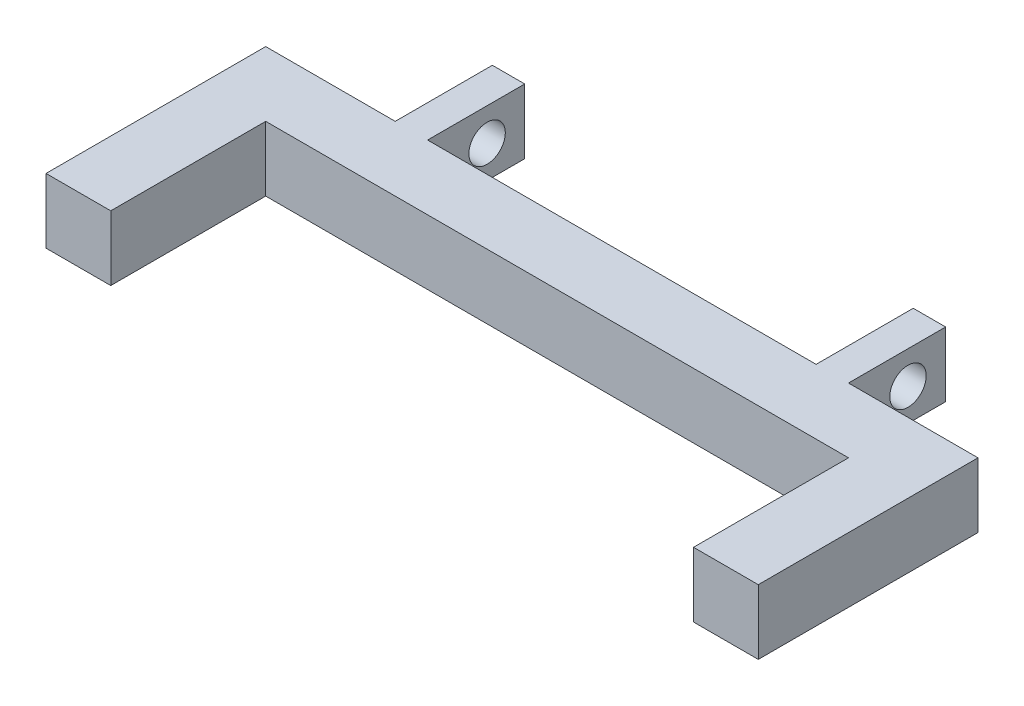
ISO-10303-21;
HEADER;
FILE_DESCRIPTION(('STEP AP214'),'2;1');
FILE_NAME('part.step','',(''),(''),'','','');
FILE_SCHEMA(('AUTOMOTIVE_DESIGN { 1 0 10303 214 1 1 1 1 }'));
ENDSEC;
DATA;
#1=APPLICATION_CONTEXT('core data for automotive mechanical design processes');
#2=APPLICATION_PROTOCOL_DEFINITION('international standard','automotive_design',2000,#1);
#3=PRODUCT_CONTEXT('',#1,'mechanical');
#4=PRODUCT('Part','Part','',(#3));
#5=PRODUCT_RELATED_PRODUCT_CATEGORY('part','',(#4));
#6=PRODUCT_DEFINITION_FORMATION('','',#4);
#7=PRODUCT_DEFINITION_CONTEXT('part definition',#1,'design');
#8=PRODUCT_DEFINITION('design','',#6,#7);
#9=PRODUCT_DEFINITION_SHAPE('','',#8);
#10=(LENGTH_UNIT() NAMED_UNIT(*) SI_UNIT(.MILLI.,.METRE.));
#11=(NAMED_UNIT(*) PLANE_ANGLE_UNIT() SI_UNIT($,.RADIAN.));
#12=(NAMED_UNIT(*) SI_UNIT($,.STERADIAN.) SOLID_ANGLE_UNIT());
#13=UNCERTAINTY_MEASURE_WITH_UNIT(LENGTH_MEASURE(1.E-05),#10,'distance_accuracy_value','');
#14=(GEOMETRIC_REPRESENTATION_CONTEXT(3) GLOBAL_UNCERTAINTY_ASSIGNED_CONTEXT((#13)) GLOBAL_UNIT_ASSIGNED_CONTEXT((#10,
#11,#12)) REPRESENTATION_CONTEXT('',''));
#15=CARTESIAN_POINT('',(0.,0.,0.));
#16=DIRECTION('',(0.,0.,1.));
#17=DIRECTION('',(1.,0.,0.));
#18=AXIS2_PLACEMENT_3D('',#15,#16,#17);
#19=CARTESIAN_POINT('',(228.6,50.8,0.));
#20=DIRECTION('',(-1.,0.,0.));
#21=DIRECTION('',(0.,0.,1.));
#22=AXIS2_PLACEMENT_3D('',#19,#20,#21);
#23=PLANE('',#22);
#24=DIRECTION('',(0.,0.,-1.));
#25=VECTOR('',#24,1.);
#26=CARTESIAN_POINT('',(228.6,0.,0.));
#27=LINE('',#26,#25);
#28=CARTESIAN_POINT('',(228.6,0.,86.1846503260621));
#29=VERTEX_POINT('',#28);
#30=CARTESIAN_POINT('',(228.6,0.,-35.3846503260623));
#31=VERTEX_POINT('',#30);
#32=EDGE_CURVE('E190',#29,#31,#27,.T.);
#33=ORIENTED_EDGE('',*,*,#32,.F.);
#34=DIRECTION('',(0.,-1.,0.));
#35=VECTOR('',#34,1.);
#36=CARTESIAN_POINT('',(228.6,50.8,86.1846503260621));
#37=LINE('',#36,#35);
#38=CARTESIAN_POINT('',(228.6,50.8,86.1846503260621));
#39=VERTEX_POINT('',#38);
#40=EDGE_CURVE('E11',#39,#29,#37,.T.);
#41=ORIENTED_EDGE('',*,*,#40,.F.);
#42=DIRECTION('',(0.,0.,-1.));
#43=VECTOR('',#42,1.);
#44=CARTESIAN_POINT('',(228.6,50.8,0.));
#45=LINE('',#44,#43);
#46=CARTESIAN_POINT('',(228.6,50.8,-35.3846503260623));
#47=VERTEX_POINT('',#46);
#48=EDGE_CURVE('E241',#39,#47,#45,.T.);
#49=ORIENTED_EDGE('',*,*,#48,.T.);
#50=DIRECTION('',(0.,-1.,0.));
#51=VECTOR('',#50,1.);
#52=CARTESIAN_POINT('',(228.6,50.8,-35.3846503260623));
#53=LINE('',#52,#51);
#54=EDGE_CURVE('E118',#47,#31,#53,.T.);
#55=ORIENTED_EDGE('',*,*,#54,.T.);
#56=EDGE_LOOP('',(#33,#41,#49,#55));
#57=FACE_BOUND('',#56,.T.);
#58=ADVANCED_FACE('F41',(#57),#23,.T.);
#59=CARTESIAN_POINT('',(0.,50.8,86.1846503260622));
#60=DIRECTION('',(0.,0.,-1.));
#61=DIRECTION('',(-1.,0.,0.));
#62=AXIS2_PLACEMENT_3D('',#59,#60,#61);
#63=PLANE('',#62);
#64=DIRECTION('',(1.,0.,0.));
#65=VECTOR('',#64,1.);
#66=CARTESIAN_POINT('',(0.,0.,86.1846503260622));
#67=LINE('',#66,#65);
#68=CARTESIAN_POINT('',(279.4,0.,86.1846503260621));
#69=VERTEX_POINT('',#68);
#70=EDGE_CURVE('E194',#29,#69,#67,.T.);
#71=ORIENTED_EDGE('',*,*,#70,.T.);
#72=DIRECTION('',(0.,-1.,0.));
#73=VECTOR('',#72,1.);
#74=CARTESIAN_POINT('',(279.4,50.8,86.1846503260621));
#75=LINE('',#74,#73);
#76=CARTESIAN_POINT('',(279.4,50.8,86.1846503260621));
#77=VERTEX_POINT('',#76);
#78=EDGE_CURVE('E51',#77,#69,#75,.T.);
#79=ORIENTED_EDGE('',*,*,#78,.F.);
#80=DIRECTION('',(1.,0.,0.));
#81=VECTOR('',#80,1.);
#82=CARTESIAN_POINT('',(0.,50.8,86.1846503260622));
#83=LINE('',#82,#81);
#84=EDGE_CURVE('E173',#39,#77,#83,.T.);
#85=ORIENTED_EDGE('',*,*,#84,.F.);
#86=ORIENTED_EDGE('',*,*,#40,.T.);
#87=EDGE_LOOP('',(#71,#79,#85,#86));
#88=FACE_BOUND('',#87,.T.);
#89=ADVANCED_FACE('F371',(#88),#63,.F.);
#90=CARTESIAN_POINT('',(279.4,50.8,-1.79960301461283E-13));
#91=DIRECTION('',(-1.,0.,0.));
#92=DIRECTION('',(0.,0.,1.));
#93=AXIS2_PLACEMENT_3D('',#90,#91,#92);
#94=PLANE('',#93);
#95=DIRECTION('',(0.,0.,-1.));
#96=VECTOR('',#95,1.);
#97=CARTESIAN_POINT('',(279.4,0.,-1.79960301461283E-13));
#98=LINE('',#97,#96);
#99=CARTESIAN_POINT('',(279.4,0.,-86.1846503260623));
#100=VERTEX_POINT('',#99);
#101=EDGE_CURVE('E198',#69,#100,#98,.T.);
#102=ORIENTED_EDGE('',*,*,#101,.T.);
#103=DIRECTION('',(0.,-1.,0.));
#104=VECTOR('',#103,1.);
#105=CARTESIAN_POINT('',(279.4,50.8,-86.1846503260623));
#106=LINE('',#105,#104);
#107=CARTESIAN_POINT('',(279.4,50.8,-86.1846503260623));
#108=VERTEX_POINT('',#107);
#109=EDGE_CURVE('E275',#108,#100,#106,.T.);
#110=ORIENTED_EDGE('',*,*,#109,.F.);
#111=DIRECTION('',(0.,0.,-1.));
#112=VECTOR('',#111,1.);
#113=CARTESIAN_POINT('',(279.4,50.8,-1.79960301461283E-13));
#114=LINE('',#113,#112);
#115=EDGE_CURVE('E286',#77,#108,#114,.T.);
#116=ORIENTED_EDGE('',*,*,#115,.F.);
#117=ORIENTED_EDGE('',*,*,#78,.T.);
#118=EDGE_LOOP('',(#102,#110,#116,#117));
#119=FACE_BOUND('',#118,.T.);
#120=ADVANCED_FACE('F284',(#119),#94,.F.);
#121=CARTESIAN_POINT('',(0.,50.8,-86.1846503260623));
#122=DIRECTION('',(0.,0.,-1.));
#123=DIRECTION('',(-1.,0.,0.));
#124=AXIS2_PLACEMENT_3D('',#121,#122,#123);
#125=PLANE('',#124);
#126=DIRECTION('',(1.,0.,0.));
#127=VECTOR('',#126,1.);
#128=CARTESIAN_POINT('',(0.,0.,-86.1846503260623));
#129=LINE('',#128,#127);
#130=CARTESIAN_POINT('',(177.8,0.,-86.1846503260623));
#131=VERTEX_POINT('',#130);
#132=EDGE_CURVE('E202',#131,#100,#129,.T.);
#133=ORIENTED_EDGE('',*,*,#132,.F.);
#134=DIRECTION('',(0.,-1.,0.));
#135=VECTOR('',#134,1.);
#136=CARTESIAN_POINT('',(177.8,50.8,-86.1846503260623));
#137=LINE('',#136,#135);
#138=CARTESIAN_POINT('',(177.8,50.8,-86.1846503260623));
#139=VERTEX_POINT('',#138);
#140=EDGE_CURVE('E272',#139,#131,#137,.T.);
#141=ORIENTED_EDGE('',*,*,#140,.F.);
#142=DIRECTION('',(1.,0.,0.));
#143=VECTOR('',#142,1.);
#144=CARTESIAN_POINT('',(0.,50.8,-86.1846503260623));
#145=LINE('',#144,#143);
#146=EDGE_CURVE('E298',#139,#108,#145,.T.);
#147=ORIENTED_EDGE('',*,*,#146,.T.);
#148=ORIENTED_EDGE('',*,*,#109,.T.);
#149=EDGE_LOOP('',(#133,#141,#147,#148));
#150=FACE_BOUND('',#149,.T.);
#151=ADVANCED_FACE('F294',(#150),#125,.T.);
#152=CARTESIAN_POINT('',(177.8,50.8,0.));
#153=DIRECTION('',(-1.,0.,0.));
#154=DIRECTION('',(0.,0.,1.));
#155=AXIS2_PLACEMENT_3D('',#152,#153,#154);
#156=PLANE('',#155);
#157=CARTESIAN_POINT('',(177.8,25.273316146111,-132.859522709877));
#158=DIRECTION('',(1.,0.,0.));
#159=DIRECTION('',(0.,0.,-1.));
#160=AXIS2_PLACEMENT_3D('',#157,#158,#159);
#161=CIRCLE('',#160,14.2875);
#162=CARTESIAN_POINT('',(177.8,25.273316146111,-147.147022709877));
#163=VERTEX_POINT('',#162);
#164=EDGE_CURVE('E363',#163,#163,#161,.T.);
#165=ORIENTED_EDGE('',*,*,#164,.F.);
#166=EDGE_LOOP('',(#165));
#167=FACE_BOUND('',#166,.T.);
#168=DIRECTION('',(0.,0.,-1.));
#169=VECTOR('',#168,1.);
#170=CARTESIAN_POINT('',(177.8,0.,0.));
#171=LINE('',#170,#169);
#172=CARTESIAN_POINT('',(177.8,0.,-162.384650326062));
#173=VERTEX_POINT('',#172);
#174=EDGE_CURVE('E206',#131,#173,#171,.T.);
#175=ORIENTED_EDGE('',*,*,#174,.T.);
#176=DIRECTION('',(0.,-1.,0.));
#177=VECTOR('',#176,1.);
#178=CARTESIAN_POINT('',(177.8,50.8,-162.384650326062));
#179=LINE('',#178,#177);
#180=CARTESIAN_POINT('',(177.8,50.8,-162.384650326062));
#181=VERTEX_POINT('',#180);
#182=EDGE_CURVE('E269',#181,#173,#179,.T.);
#183=ORIENTED_EDGE('',*,*,#182,.F.);
#184=DIRECTION('',(0.,0.,-1.));
#185=VECTOR('',#184,1.);
#186=CARTESIAN_POINT('',(177.8,50.8,0.));
#187=LINE('',#186,#185);
#188=EDGE_CURVE('E300',#139,#181,#187,.T.);
#189=ORIENTED_EDGE('',*,*,#188,.F.);
#190=ORIENTED_EDGE('',*,*,#140,.T.);
#191=EDGE_LOOP('',(#175,#183,#189,#190));
#192=FACE_BOUND('',#191,.T.);
#193=ADVANCED_FACE('F410',(#167,#192),#156,.F.);
#194=CARTESIAN_POINT('',(0.,50.8,-162.384650326062));
#195=DIRECTION('',(0.,0.,-1.));
#196=DIRECTION('',(-1.,0.,0.));
#197=AXIS2_PLACEMENT_3D('',#194,#195,#196);
#198=PLANE('',#197);
#199=DIRECTION('',(1.,0.,0.));
#200=VECTOR('',#199,1.);
#201=CARTESIAN_POINT('',(0.,0.,-162.384650326062));
#202=LINE('',#201,#200);
#203=CARTESIAN_POINT('',(152.4,0.,-162.384650326062));
#204=VERTEX_POINT('',#203);
#205=EDGE_CURVE('E212',#204,#173,#202,.T.);
#206=ORIENTED_EDGE('',*,*,#205,.F.);
#207=DIRECTION('',(0.,-1.,0.));
#208=VECTOR('',#207,1.);
#209=CARTESIAN_POINT('',(152.4,50.8,-162.384650326062));
#210=LINE('',#209,#208);
#211=CARTESIAN_POINT('',(152.4,50.8,-162.384650326062));
#212=VERTEX_POINT('',#211);
#213=EDGE_CURVE('E266',#212,#204,#210,.T.);
#214=ORIENTED_EDGE('',*,*,#213,.F.);
#215=DIRECTION('',(1.,0.,0.));
#216=VECTOR('',#215,1.);
#217=CARTESIAN_POINT('',(0.,50.8,-162.384650326062));
#218=LINE('',#217,#216);
#219=EDGE_CURVE('E306',#212,#181,#218,.T.);
#220=ORIENTED_EDGE('',*,*,#219,.T.);
#221=ORIENTED_EDGE('',*,*,#182,.T.);
#222=EDGE_LOOP('',(#206,#214,#220,#221));
#223=FACE_BOUND('',#222,.T.);
#224=ADVANCED_FACE('F406',(#223),#198,.T.);
#225=CARTESIAN_POINT('',(152.4,50.8,0.));
#226=DIRECTION('',(-1.,0.,0.));
#227=DIRECTION('',(0.,0.,1.));
#228=AXIS2_PLACEMENT_3D('',#225,#226,#227);
#229=PLANE('',#228);
#230=CARTESIAN_POINT('',(152.4,25.273316146111,-132.859522709877));
#231=DIRECTION('',(-1.,0.,0.));
#232=DIRECTION('',(0.,0.,1.));
#233=AXIS2_PLACEMENT_3D('',#230,#231,#232);
#234=CIRCLE('',#233,14.2875);
#235=CARTESIAN_POINT('',(152.4,25.273316146111,-118.572022709877));
#236=VERTEX_POINT('',#235);
#237=EDGE_CURVE('E195',#236,#236,#234,.T.);
#238=ORIENTED_EDGE('',*,*,#237,.F.);
#239=EDGE_LOOP('',(#238));
#240=FACE_BOUND('',#239,.T.);
#241=DIRECTION('',(0.,0.,-1.));
#242=VECTOR('',#241,1.);
#243=CARTESIAN_POINT('',(152.4,0.,0.));
#244=LINE('',#243,#242);
#245=CARTESIAN_POINT('',(152.4,0.,-86.1846503260623));
#246=VERTEX_POINT('',#245);
#247=EDGE_CURVE('E216',#246,#204,#244,.T.);
#248=ORIENTED_EDGE('',*,*,#247,.F.);
#249=DIRECTION('',(0.,-1.,0.));
#250=VECTOR('',#249,1.);
#251=CARTESIAN_POINT('',(152.4,50.8,-86.1846503260623));
#252=LINE('',#251,#250);
#253=CARTESIAN_POINT('',(152.4,50.8,-86.1846503260623));
#254=VERTEX_POINT('',#253);
#255=EDGE_CURVE('E263',#254,#246,#252,.T.);
#256=ORIENTED_EDGE('',*,*,#255,.F.);
#257=DIRECTION('',(0.,0.,-1.));
#258=VECTOR('',#257,1.);
#259=CARTESIAN_POINT('',(152.4,50.8,0.));
#260=LINE('',#259,#258);
#261=EDGE_CURVE('E315',#254,#212,#260,.T.);
#262=ORIENTED_EDGE('',*,*,#261,.T.);
#263=ORIENTED_EDGE('',*,*,#213,.T.);
#264=EDGE_LOOP('',(#248,#256,#262,#263));
#265=FACE_BOUND('',#264,.T.);
#266=ADVANCED_FACE('F403',(#240,#265),#229,.T.);
#267=CARTESIAN_POINT('',(-152.4,0.,-86.1846503260623));
#268=VERTEX_POINT('',#267);
#269=EDGE_CURVE('E208',#268,#246,#129,.T.);
#270=ORIENTED_EDGE('',*,*,#269,.F.);
#271=DIRECTION('',(0.,-1.,0.));
#272=VECTOR('',#271,1.);
#273=CARTESIAN_POINT('',(-152.4,50.8,-86.1846503260623));
#274=LINE('',#273,#272);
#275=CARTESIAN_POINT('',(-152.4,50.8,-86.1846503260623));
#276=VERTEX_POINT('',#275);
#277=EDGE_CURVE('E260',#276,#268,#274,.T.);
#278=ORIENTED_EDGE('',*,*,#277,.F.);
#279=EDGE_CURVE('E303',#276,#254,#145,.T.);
#280=ORIENTED_EDGE('',*,*,#279,.T.);
#281=ORIENTED_EDGE('',*,*,#255,.T.);
#282=EDGE_LOOP('',(#270,#278,#280,#281));
#283=FACE_BOUND('',#282,.T.);
#284=ADVANCED_FACE('F390',(#283),#125,.T.);
#285=CARTESIAN_POINT('',(-152.4,50.8,0.));
#286=DIRECTION('',(-1.,0.,0.));
#287=DIRECTION('',(0.,0.,1.));
#288=AXIS2_PLACEMENT_3D('',#285,#286,#287);
#289=PLANE('',#288);
#290=CARTESIAN_POINT('',(-152.4,25.273316146111,-132.859522709877));
#291=DIRECTION('',(-1.,0.,0.));
#292=DIRECTION('',(0.,0.,1.));
#293=AXIS2_PLACEMENT_3D('',#290,#291,#292);
#294=CIRCLE('',#293,14.2875);
#295=CARTESIAN_POINT('',(-152.4,25.273316146111,-118.572022709877));
#296=VERTEX_POINT('',#295);
#297=EDGE_CURVE('E356',#296,#296,#294,.T.);
#298=ORIENTED_EDGE('',*,*,#297,.T.);
#299=EDGE_LOOP('',(#298));
#300=FACE_BOUND('',#299,.T.);
#301=DIRECTION('',(0.,0.,-1.));
#302=VECTOR('',#301,1.);
#303=CARTESIAN_POINT('',(-152.4,0.,0.));
#304=LINE('',#303,#302);
#305=CARTESIAN_POINT('',(-152.4,0.,-162.384650326062));
#306=VERTEX_POINT('',#305);
#307=EDGE_CURVE('E220',#268,#306,#304,.T.);
#308=ORIENTED_EDGE('',*,*,#307,.T.);
#309=DIRECTION('',(0.,-1.,0.));
#310=VECTOR('',#309,1.);
#311=CARTESIAN_POINT('',(-152.4,50.8,-162.384650326062));
#312=LINE('',#311,#310);
#313=CARTESIAN_POINT('',(-152.4,50.8,-162.384650326062));
#314=VERTEX_POINT('',#313);
#315=EDGE_CURVE('E257',#314,#306,#312,.T.);
#316=ORIENTED_EDGE('',*,*,#315,.F.);
#317=DIRECTION('',(0.,0.,-1.));
#318=VECTOR('',#317,1.);
#319=CARTESIAN_POINT('',(-152.4,50.8,0.));
#320=LINE('',#319,#318);
#321=EDGE_CURVE('E314',#276,#314,#320,.T.);
#322=ORIENTED_EDGE('',*,*,#321,.F.);
#323=ORIENTED_EDGE('',*,*,#277,.T.);
#324=EDGE_LOOP('',(#308,#316,#322,#323));
#325=FACE_BOUND('',#324,.T.);
#326=ADVANCED_FACE('F398',(#300,#325),#289,.F.);
#327=CARTESIAN_POINT('',(0.,50.8,-162.384650326062));
#328=DIRECTION('',(0.,0.,-1.));
#329=DIRECTION('',(-1.,0.,0.));
#330=AXIS2_PLACEMENT_3D('',#327,#328,#329);
#331=PLANE('',#330);
#332=DIRECTION('',(1.,0.,0.));
#333=VECTOR('',#332,1.);
#334=CARTESIAN_POINT('',(0.,0.,-162.384650326062));
#335=LINE('',#334,#333);
#336=CARTESIAN_POINT('',(-177.8,0.,-162.384650326062));
#337=VERTEX_POINT('',#336);
#338=EDGE_CURVE('E224',#337,#306,#335,.T.);
#339=ORIENTED_EDGE('',*,*,#338,.F.);
#340=DIRECTION('',(0.,-1.,0.));
#341=VECTOR('',#340,1.);
#342=CARTESIAN_POINT('',(-177.8,50.8,-162.384650326062));
#343=LINE('',#342,#341);
#344=CARTESIAN_POINT('',(-177.8,50.8,-162.384650326062));
#345=VERTEX_POINT('',#344);
#346=EDGE_CURVE('E254',#345,#337,#343,.T.);
#347=ORIENTED_EDGE('',*,*,#346,.F.);
#348=DIRECTION('',(1.,0.,0.));
#349=VECTOR('',#348,1.);
#350=CARTESIAN_POINT('',(0.,50.8,-162.384650326062));
#351=LINE('',#350,#349);
#352=EDGE_CURVE('E320',#345,#314,#351,.T.);
#353=ORIENTED_EDGE('',*,*,#352,.T.);
#354=ORIENTED_EDGE('',*,*,#315,.T.);
#355=EDGE_LOOP('',(#339,#347,#353,#354));
#356=FACE_BOUND('',#355,.T.);
#357=ADVANCED_FACE('F394',(#356),#331,.T.);
#358=CARTESIAN_POINT('',(-177.8,50.8,0.));
#359=DIRECTION('',(-1.,0.,0.));
#360=DIRECTION('',(0.,0.,1.));
#361=AXIS2_PLACEMENT_3D('',#358,#359,#360);
#362=PLANE('',#361);
#363=CARTESIAN_POINT('',(-177.8,25.273316146111,-132.859522709877));
#364=DIRECTION('',(-1.,0.,0.));
#365=DIRECTION('',(0.,0.,1.));
#366=AXIS2_PLACEMENT_3D('',#363,#364,#365);
#367=CIRCLE('',#366,14.2875);
#368=CARTESIAN_POINT('',(-177.8,25.273316146111,-118.572022709877));
#369=VERTEX_POINT('',#368);
#370=EDGE_CURVE('E44',#369,#369,#367,.T.);
#371=ORIENTED_EDGE('',*,*,#370,.F.);
#372=EDGE_LOOP('',(#371));
#373=FACE_BOUND('',#372,.T.);
#374=DIRECTION('',(0.,0.,-1.));
#375=VECTOR('',#374,1.);
#376=CARTESIAN_POINT('',(-177.8,0.,0.));
#377=LINE('',#376,#375);
#378=CARTESIAN_POINT('',(-177.8,0.,-86.1846503260623));
#379=VERTEX_POINT('',#378);
#380=EDGE_CURVE('E228',#379,#337,#377,.T.);
#381=ORIENTED_EDGE('',*,*,#380,.F.);
#382=DIRECTION('',(0.,-1.,0.));
#383=VECTOR('',#382,1.);
#384=CARTESIAN_POINT('',(-177.8,50.8,-86.1846503260623));
#385=LINE('',#384,#383);
#386=CARTESIAN_POINT('',(-177.8,50.8,-86.1846503260623));
#387=VERTEX_POINT('',#386);
#388=EDGE_CURVE('E251',#387,#379,#385,.T.);
#389=ORIENTED_EDGE('',*,*,#388,.F.);
#390=DIRECTION('',(0.,0.,-1.));
#391=VECTOR('',#390,1.);
#392=CARTESIAN_POINT('',(-177.8,50.8,0.));
#393=LINE('',#392,#391);
#394=EDGE_CURVE('E311',#387,#345,#393,.T.);
#395=ORIENTED_EDGE('',*,*,#394,.T.);
#396=ORIENTED_EDGE('',*,*,#346,.T.);
#397=EDGE_LOOP('',(#381,#389,#395,#396));
#398=FACE_BOUND('',#397,.T.);
#399=ADVANCED_FACE('F337',(#373,#398),#362,.T.);
#400=CARTESIAN_POINT('',(-279.4,0.,-86.1846503260623));
#401=VERTEX_POINT('',#400);
#402=EDGE_CURVE('E207',#401,#379,#129,.T.);
#403=ORIENTED_EDGE('',*,*,#402,.F.);
#404=DIRECTION('',(0.,-1.,0.));
#405=VECTOR('',#404,1.);
#406=CARTESIAN_POINT('',(-279.4,50.8,-86.1846503260623));
#407=LINE('',#406,#405);
#408=CARTESIAN_POINT('',(-279.4,50.8,-86.1846503260623));
#409=VERTEX_POINT('',#408);
#410=EDGE_CURVE('E248',#409,#401,#407,.T.);
#411=ORIENTED_EDGE('',*,*,#410,.F.);
#412=EDGE_CURVE('E302',#409,#387,#145,.T.);
#413=ORIENTED_EDGE('',*,*,#412,.T.);
#414=ORIENTED_EDGE('',*,*,#388,.T.);
#415=EDGE_LOOP('',(#403,#411,#413,#414));
#416=FACE_BOUND('',#415,.T.);
#417=ADVANCED_FACE('F342',(#416),#125,.T.);
#418=CARTESIAN_POINT('',(-279.4,50.8,0.));
#419=DIRECTION('',(-1.,0.,0.));
#420=DIRECTION('',(0.,0.,1.));
#421=AXIS2_PLACEMENT_3D('',#418,#419,#420);
#422=PLANE('',#421);
#423=DIRECTION('',(0.,0.,-1.));
#424=VECTOR('',#423,1.);
#425=CARTESIAN_POINT('',(-279.4,0.,0.));
#426=LINE('',#425,#424);
#427=CARTESIAN_POINT('',(-279.4,0.,86.1846503260623));
#428=VERTEX_POINT('',#427);
#429=EDGE_CURVE('E232',#428,#401,#426,.T.);
#430=ORIENTED_EDGE('',*,*,#429,.F.);
#431=DIRECTION('',(0.,-1.,0.));
#432=VECTOR('',#431,1.);
#433=CARTESIAN_POINT('',(-279.4,50.8,86.1846503260623));
#434=LINE('',#433,#432);
#435=CARTESIAN_POINT('',(-279.4,50.8,86.1846503260623));
#436=VERTEX_POINT('',#435);
#437=EDGE_CURVE('E179',#436,#428,#434,.T.);
#438=ORIENTED_EDGE('',*,*,#437,.F.);
#439=DIRECTION('',(0.,0.,-1.));
#440=VECTOR('',#439,1.);
#441=CARTESIAN_POINT('',(-279.4,50.8,0.));
#442=LINE('',#441,#440);
#443=EDGE_CURVE('E169',#436,#409,#442,.T.);
#444=ORIENTED_EDGE('',*,*,#443,.T.);
#445=ORIENTED_EDGE('',*,*,#410,.T.);
#446=EDGE_LOOP('',(#430,#438,#444,#445));
#447=FACE_BOUND('',#446,.T.);
#448=ADVANCED_FACE('F346',(#447),#422,.T.);
#449=CARTESIAN_POINT('',(-228.6,0.,86.1846503260623));
#450=VERTEX_POINT('',#449);
#451=EDGE_CURVE('E177',#428,#450,#67,.T.);
#452=ORIENTED_EDGE('',*,*,#451,.T.);
#453=DIRECTION('',(0.,-1.,0.));
#454=VECTOR('',#453,1.);
#455=CARTESIAN_POINT('',(-228.6,50.8,86.1846503260623));
#456=LINE('',#455,#454);
#457=CARTESIAN_POINT('',(-228.6,50.8,86.1846503260623));
#458=VERTEX_POINT('',#457);
#459=EDGE_CURVE('E174',#458,#450,#456,.T.);
#460=ORIENTED_EDGE('',*,*,#459,.F.);
#461=EDGE_CURVE('E162',#436,#458,#83,.T.);
#462=ORIENTED_EDGE('',*,*,#461,.F.);
#463=ORIENTED_EDGE('',*,*,#437,.T.);
#464=EDGE_LOOP('',(#452,#460,#462,#463));
#465=FACE_BOUND('',#464,.T.);
#466=ADVANCED_FACE('F175',(#465),#63,.F.);
#467=CARTESIAN_POINT('',(-228.6,50.8,0.));
#468=DIRECTION('',(-1.,0.,0.));
#469=DIRECTION('',(0.,0.,1.));
#470=AXIS2_PLACEMENT_3D('',#467,#468,#469);
#471=PLANE('',#470);
#472=DIRECTION('',(0.,0.,-1.));
#473=VECTOR('',#472,1.);
#474=CARTESIAN_POINT('',(-228.6,0.,0.));
#475=LINE('',#474,#473);
#476=CARTESIAN_POINT('',(-228.6,0.,-35.3846503260623));
#477=VERTEX_POINT('',#476);
#478=EDGE_CURVE('E111',#450,#477,#475,.T.);
#479=ORIENTED_EDGE('',*,*,#478,.T.);
#480=DIRECTION('',(0.,-1.,0.));
#481=VECTOR('',#480,1.);
#482=CARTESIAN_POINT('',(-228.6,50.8,-35.3846503260623));
#483=LINE('',#482,#481);
#484=CARTESIAN_POINT('',(-228.6,50.8,-35.3846503260623));
#485=VERTEX_POINT('',#484);
#486=EDGE_CURVE('E180',#485,#477,#483,.T.);
#487=ORIENTED_EDGE('',*,*,#486,.F.);
#488=DIRECTION('',(0.,0.,-1.));
#489=VECTOR('',#488,1.);
#490=CARTESIAN_POINT('',(-228.6,50.8,0.));
#491=LINE('',#490,#489);
#492=EDGE_CURVE('E166',#458,#485,#491,.T.);
#493=ORIENTED_EDGE('',*,*,#492,.F.);
#494=ORIENTED_EDGE('',*,*,#459,.T.);
#495=EDGE_LOOP('',(#479,#487,#493,#494));
#496=FACE_BOUND('',#495,.T.);
#497=ADVANCED_FACE('F182',(#496),#471,.F.);
#498=CARTESIAN_POINT('',(0.,50.8,-35.3846503260623));
#499=DIRECTION('',(0.,0.,-1.));
#500=DIRECTION('',(-1.,0.,0.));
#501=AXIS2_PLACEMENT_3D('',#498,#499,#500);
#502=PLANE('',#501);
#503=DIRECTION('',(1.,0.,0.));
#504=VECTOR('',#503,1.);
#505=CARTESIAN_POINT('',(0.,0.,-35.3846503260623));
#506=LINE('',#505,#504);
#507=EDGE_CURVE('E238',#477,#31,#506,.T.);
#508=ORIENTED_EDGE('',*,*,#507,.T.);
#509=ORIENTED_EDGE('',*,*,#54,.F.);
#510=DIRECTION('',(1.,0.,0.));
#511=VECTOR('',#510,1.);
#512=CARTESIAN_POINT('',(0.,50.8,-35.3846503260623));
#513=LINE('',#512,#511);
#514=EDGE_CURVE('E59',#485,#47,#513,.T.);
#515=ORIENTED_EDGE('',*,*,#514,.F.);
#516=ORIENTED_EDGE('',*,*,#486,.T.);
#517=EDGE_LOOP('',(#508,#509,#515,#516));
#518=FACE_BOUND('',#517,.T.);
#519=ADVANCED_FACE('F385',(#518),#502,.F.);
#520=CARTESIAN_POINT('',(0.,50.8,0.));
#521=DIRECTION('',(0.,1.,0.));
#522=DIRECTION('',(0.,0.,1.));
#523=AXIS2_PLACEMENT_3D('',#520,#521,#522);
#524=PLANE('',#523);
#525=ORIENTED_EDGE('',*,*,#48,.F.);
#526=ORIENTED_EDGE('',*,*,#84,.T.);
#527=ORIENTED_EDGE('',*,*,#115,.T.);
#528=ORIENTED_EDGE('',*,*,#146,.F.);
#529=ORIENTED_EDGE('',*,*,#188,.T.);
#530=ORIENTED_EDGE('',*,*,#219,.F.);
#531=ORIENTED_EDGE('',*,*,#261,.F.);
#532=ORIENTED_EDGE('',*,*,#279,.F.);
#533=ORIENTED_EDGE('',*,*,#321,.T.);
#534=ORIENTED_EDGE('',*,*,#352,.F.);
#535=ORIENTED_EDGE('',*,*,#394,.F.);
#536=ORIENTED_EDGE('',*,*,#412,.F.);
#537=ORIENTED_EDGE('',*,*,#443,.F.);
#538=ORIENTED_EDGE('',*,*,#461,.T.);
#539=ORIENTED_EDGE('',*,*,#492,.T.);
#540=ORIENTED_EDGE('',*,*,#514,.T.);
#541=EDGE_LOOP('',(#525,#526,#527,#528,#529,#530,#531,#532,#533,#534,#535,#536,#537,#538,#539,#540));
#542=FACE_BOUND('',#541,.T.);
#543=ADVANCED_FACE('F164',(#542),#524,.T.);
#544=CARTESIAN_POINT('',(0.,0.,0.));
#545=DIRECTION('',(0.,1.,0.));
#546=DIRECTION('',(0.,0.,1.));
#547=AXIS2_PLACEMENT_3D('',#544,#545,#546);
#548=PLANE('',#547);
#549=ORIENTED_EDGE('',*,*,#32,.T.);
#550=ORIENTED_EDGE('',*,*,#507,.F.);
#551=ORIENTED_EDGE('',*,*,#478,.F.);
#552=ORIENTED_EDGE('',*,*,#451,.F.);
#553=ORIENTED_EDGE('',*,*,#429,.T.);
#554=ORIENTED_EDGE('',*,*,#402,.T.);
#555=ORIENTED_EDGE('',*,*,#380,.T.);
#556=ORIENTED_EDGE('',*,*,#338,.T.);
#557=ORIENTED_EDGE('',*,*,#307,.F.);
#558=ORIENTED_EDGE('',*,*,#269,.T.);
#559=ORIENTED_EDGE('',*,*,#247,.T.);
#560=ORIENTED_EDGE('',*,*,#205,.T.);
#561=ORIENTED_EDGE('',*,*,#174,.F.);
#562=ORIENTED_EDGE('',*,*,#132,.T.);
#563=ORIENTED_EDGE('',*,*,#101,.F.);
#564=ORIENTED_EDGE('',*,*,#70,.F.);
#565=EDGE_LOOP('',(#549,#550,#551,#552,#553,#554,#555,#556,#557,#558,#559,#560,#561,#562,#563,#564));
#566=FACE_BOUND('',#565,.T.);
#567=ADVANCED_FACE('F290',(#566),#548,.F.);
#568=CARTESIAN_POINT('',(-279.4,25.273316146111,-132.859522709877));
#569=DIRECTION('',(1.,0.,0.));
#570=DIRECTION('',(0.,0.,-1.));
#571=AXIS2_PLACEMENT_3D('',#568,#569,#570);
#572=CYLINDRICAL_SURFACE('',#571,14.2875);
#573=ORIENTED_EDGE('',*,*,#370,.T.);
#574=EDGE_LOOP('',(#573));
#575=FACE_BOUND('',#574,.T.);
#576=ORIENTED_EDGE('',*,*,#297,.F.);
#577=EDGE_LOOP('',(#576));
#578=FACE_BOUND('',#577,.T.);
#579=ADVANCED_FACE('F493',(#575,#578),#572,.F.);
#580=ORIENTED_EDGE('',*,*,#237,.T.);
#581=EDGE_LOOP('',(#580));
#582=FACE_BOUND('',#581,.T.);
#583=ORIENTED_EDGE('',*,*,#164,.T.);
#584=EDGE_LOOP('',(#583));
#585=FACE_BOUND('',#584,.T.);
#586=ADVANCED_FACE('F563',(#582,#585),#572,.F.);
#587=CLOSED_SHELL('',(#58,#89,#120,#151,#193,#224,#266,#284,#326,#357,#399,#417,#448,#466,#497,
#519,#543,#567,#579,#586));
#588=MANIFOLD_SOLID_BREP('B2',#587);
#589=ADVANCED_BREP_SHAPE_REPRESENTATION('',(#18,#588),#14);
#590=SHAPE_DEFINITION_REPRESENTATION(#9,#589);
ENDSEC;
END-ISO-10303-21;
